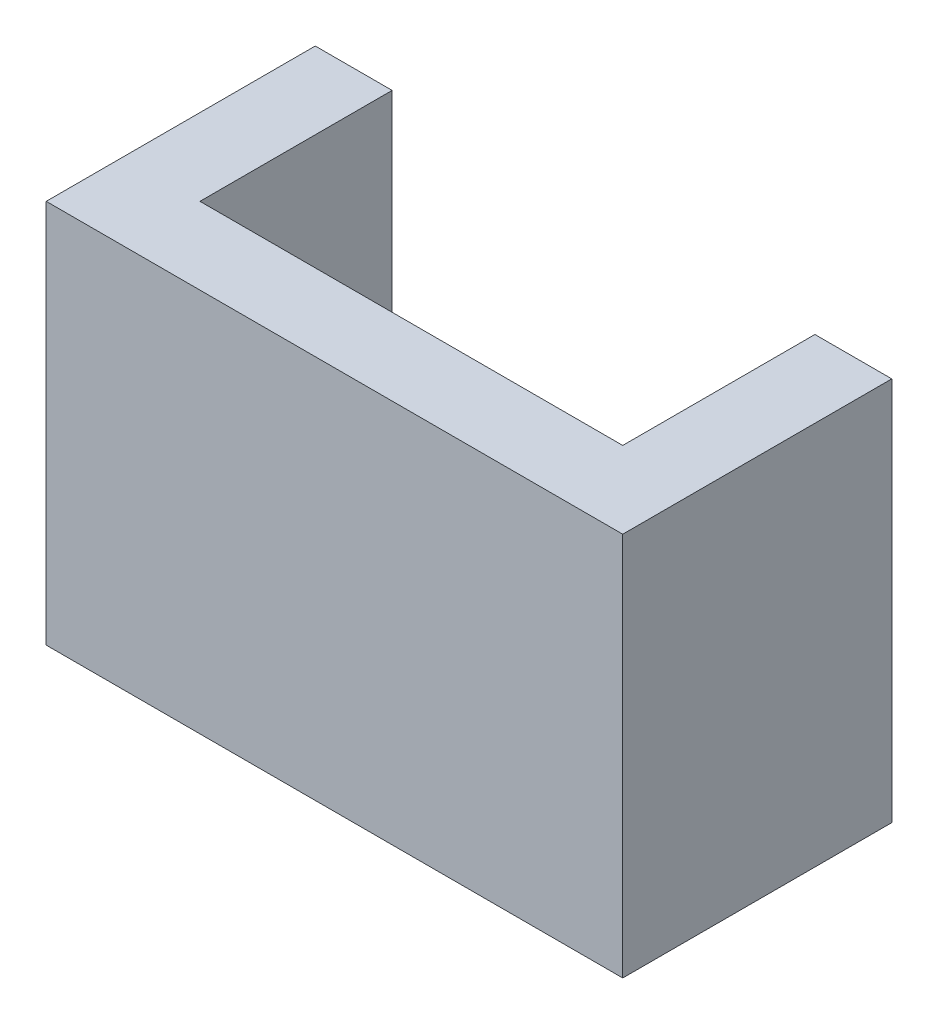
ISO-10303-21;
HEADER;
FILE_DESCRIPTION(('STEP AP214'),'2;1');
FILE_NAME('part.step','',(''),(''),'','','');
FILE_SCHEMA(('AUTOMOTIVE_DESIGN { 1 0 10303 214 1 1 1 1 }'));
ENDSEC;
DATA;
#1=APPLICATION_CONTEXT('core data for automotive mechanical design processes');
#2=APPLICATION_PROTOCOL_DEFINITION('international standard','automotive_design',2000,#1);
#3=PRODUCT_CONTEXT('',#1,'mechanical');
#4=PRODUCT('Part','Part','',(#3));
#5=PRODUCT_RELATED_PRODUCT_CATEGORY('part','',(#4));
#6=PRODUCT_DEFINITION_FORMATION('','',#4);
#7=PRODUCT_DEFINITION_CONTEXT('part definition',#1,'design');
#8=PRODUCT_DEFINITION('design','',#6,#7);
#9=PRODUCT_DEFINITION_SHAPE('','',#8);
#10=(LENGTH_UNIT() NAMED_UNIT(*) SI_UNIT(.MILLI.,.METRE.));
#11=(NAMED_UNIT(*) PLANE_ANGLE_UNIT() SI_UNIT($,.RADIAN.));
#12=(NAMED_UNIT(*) SI_UNIT($,.STERADIAN.) SOLID_ANGLE_UNIT());
#13=UNCERTAINTY_MEASURE_WITH_UNIT(LENGTH_MEASURE(1.E-05),#10,'distance_accuracy_value','');
#14=(GEOMETRIC_REPRESENTATION_CONTEXT(3) GLOBAL_UNCERTAINTY_ASSIGNED_CONTEXT((#13)) GLOBAL_UNIT_ASSIGNED_CONTEXT((#10,
#11,#12)) REPRESENTATION_CONTEXT('',''));
#15=CARTESIAN_POINT('',(0.,0.,0.));
#16=DIRECTION('',(0.,0.,1.));
#17=DIRECTION('',(1.,0.,0.));
#18=AXIS2_PLACEMENT_3D('',#15,#16,#17);
#19=CARTESIAN_POINT('',(0.,0.,0.));
#20=DIRECTION('',(0.,0.,1.));
#21=DIRECTION('',(1.,0.,0.));
#22=AXIS2_PLACEMENT_3D('',#19,#20,#21);
#23=PLANE('',#22);
#24=DIRECTION('',(-1.,0.,0.));
#25=VECTOR('',#24,1.);
#26=CARTESIAN_POINT('',(-7.17780429594272,3.9200477326969,0.));
#27=LINE('',#26,#25);
#28=CARTESIAN_POINT('',(-5.17780429594272,3.9200477326969,0.));
#29=VERTEX_POINT('',#28);
#30=CARTESIAN_POINT('',(-7.17780429594272,3.9200477326969,0.));
#31=VERTEX_POINT('',#30);
#32=EDGE_CURVE('E85',#29,#31,#27,.T.);
#33=ORIENTED_EDGE('',*,*,#32,.F.);
#34=DIRECTION('',(0.,1.,0.));
#35=VECTOR('',#34,1.);
#36=CARTESIAN_POINT('',(-5.17780429594272,-18.1629982408977,0.));
#37=LINE('',#36,#35);
#38=CARTESIAN_POINT('',(-5.17780429594272,-6.0799522673031,0.));
#39=VERTEX_POINT('',#38);
#40=EDGE_CURVE('E130',#39,#29,#37,.T.);
#41=ORIENTED_EDGE('',*,*,#40,.F.);
#42=DIRECTION('',(1.,0.,0.));
#43=VECTOR('',#42,1.);
#44=CARTESIAN_POINT('',(-7.17780429594271,-6.0799522673031,0.));
#45=LINE('',#44,#43);
#46=CARTESIAN_POINT('',(-7.17780429594271,-6.0799522673031,0.));
#47=VERTEX_POINT('',#46);
#48=EDGE_CURVE('E169',#47,#39,#45,.T.);
#49=ORIENTED_EDGE('',*,*,#48,.F.);
#50=DIRECTION('',(0.,-1.,0.));
#51=VECTOR('',#50,1.);
#52=CARTESIAN_POINT('',(-7.17780429594272,3.9200477326969,0.));
#53=LINE('',#52,#51);
#54=EDGE_CURVE('E151',#31,#47,#53,.T.);
#55=ORIENTED_EDGE('',*,*,#54,.F.);
#56=EDGE_LOOP('',(#33,#41,#49,#55));
#57=FACE_BOUND('',#56,.T.);
#58=ADVANCED_FACE('F39',(#57),#23,.F.);
#59=CARTESIAN_POINT('',(-7.17780429594272,3.9200477326969,7.));
#60=DIRECTION('',(1.,0.,0.));
#61=DIRECTION('',(0.,1.,0.));
#62=AXIS2_PLACEMENT_3D('',#59,#60,#61);
#63=PLANE('',#62);
#64=ORIENTED_EDGE('',*,*,#54,.T.);
#65=DIRECTION('',(0.,0.,-1.));
#66=VECTOR('',#65,1.);
#67=CARTESIAN_POINT('',(-7.17780429594271,-6.0799522673031,7.));
#68=LINE('',#67,#66);
#69=CARTESIAN_POINT('',(-7.17780429594271,-6.0799522673031,7.));
#70=VERTEX_POINT('',#69);
#71=EDGE_CURVE('E11',#70,#47,#68,.T.);
#72=ORIENTED_EDGE('',*,*,#71,.F.);
#73=DIRECTION('',(0.,-1.,0.));
#74=VECTOR('',#73,1.);
#75=CARTESIAN_POINT('',(-7.17780429594272,3.9200477326969,7.));
#76=LINE('',#75,#74);
#77=CARTESIAN_POINT('',(-7.17780429594272,3.9200477326969,7.));
#78=VERTEX_POINT('',#77);
#79=EDGE_CURVE('E153',#78,#70,#76,.T.);
#80=ORIENTED_EDGE('',*,*,#79,.F.);
#81=DIRECTION('',(0.,0.,-1.));
#82=VECTOR('',#81,1.);
#83=CARTESIAN_POINT('',(-7.17780429594272,3.9200477326969,7.));
#84=LINE('',#83,#82);
#85=EDGE_CURVE('E164',#78,#31,#84,.T.);
#86=ORIENTED_EDGE('',*,*,#85,.T.);
#87=EDGE_LOOP('',(#64,#72,#80,#86));
#88=FACE_BOUND('',#87,.T.);
#89=ADVANCED_FACE('F41',(#88),#63,.F.);
#90=CARTESIAN_POINT('',(-7.17780429594271,-6.0799522673031,7.));
#91=DIRECTION('',(0.,1.,0.));
#92=DIRECTION('',(0.,0.,1.));
#93=AXIS2_PLACEMENT_3D('',#90,#91,#92);
#94=PLANE('',#93);
#95=ORIENTED_EDGE('',*,*,#48,.T.);
#96=DIRECTION('',(0.,0.,-1.));
#97=VECTOR('',#96,1.);
#98=CARTESIAN_POINT('',(-5.17780429594272,-6.0799522673031,0.));
#99=LINE('',#98,#97);
#100=CARTESIAN_POINT('',(-5.17780429594271,-6.0799522673031,5.));
#101=VERTEX_POINT('',#100);
#102=EDGE_CURVE('E152',#101,#39,#99,.T.);
#103=ORIENTED_EDGE('',*,*,#102,.F.);
#104=DIRECTION('',(-1.,0.,0.));
#105=VECTOR('',#104,1.);
#106=CARTESIAN_POINT('',(-5.17780429594271,-6.0799522673031,5.));
#107=LINE('',#106,#105);
#108=CARTESIAN_POINT('',(5.82219570405728,-6.07995226730311,5.));
#109=VERTEX_POINT('',#108);
#110=EDGE_CURVE('E121',#109,#101,#107,.T.);
#111=ORIENTED_EDGE('',*,*,#110,.F.);
#112=DIRECTION('',(0.,0.,1.));
#113=VECTOR('',#112,1.);
#114=CARTESIAN_POINT('',(5.82219570405728,-6.0799522673031,0.));
#115=LINE('',#114,#113);
#116=CARTESIAN_POINT('',(5.82219570405728,-6.0799522673031,0.));
#117=VERTEX_POINT('',#116);
#118=EDGE_CURVE('E143',#117,#109,#115,.T.);
#119=ORIENTED_EDGE('',*,*,#118,.F.);
#120=CARTESIAN_POINT('',(7.82219570405729,-6.0799522673031,0.));
#121=VERTEX_POINT('',#120);
#122=EDGE_CURVE('E168',#117,#121,#45,.T.);
#123=ORIENTED_EDGE('',*,*,#122,.T.);
#124=DIRECTION('',(0.,0.,-1.));
#125=VECTOR('',#124,1.);
#126=CARTESIAN_POINT('',(7.82219570405729,-6.0799522673031,7.));
#127=LINE('',#126,#125);
#128=CARTESIAN_POINT('',(7.82219570405729,-6.0799522673031,7.));
#129=VERTEX_POINT('',#128);
#130=EDGE_CURVE('E48',#129,#121,#127,.T.);
#131=ORIENTED_EDGE('',*,*,#130,.F.);
#132=DIRECTION('',(1.,0.,0.));
#133=VECTOR('',#132,1.);
#134=CARTESIAN_POINT('',(-7.17780429594271,-6.0799522673031,7.));
#135=LINE('',#134,#133);
#136=EDGE_CURVE('E92',#70,#129,#135,.T.);
#137=ORIENTED_EDGE('',*,*,#136,.F.);
#138=ORIENTED_EDGE('',*,*,#71,.T.);
#139=EDGE_LOOP('',(#95,#103,#111,#119,#123,#131,#137,#138));
#140=FACE_BOUND('',#139,.T.);
#141=ADVANCED_FACE('F213',(#140),#94,.F.);
#142=CARTESIAN_POINT('',(7.82219570405728,3.9200477326969,7.));
#143=DIRECTION('',(-1.,0.,0.));
#144=DIRECTION('',(0.,-1.,0.));
#145=AXIS2_PLACEMENT_3D('',#142,#143,#144);
#146=PLANE('',#145);
#147=DIRECTION('',(0.,1.,0.));
#148=VECTOR('',#147,1.);
#149=CARTESIAN_POINT('',(7.82219570405728,3.9200477326969,0.));
#150=LINE('',#149,#148);
#151=CARTESIAN_POINT('',(7.82219570405728,3.9200477326969,0.));
#152=VERTEX_POINT('',#151);
#153=EDGE_CURVE('E173',#121,#152,#150,.T.);
#154=ORIENTED_EDGE('',*,*,#153,.T.);
#155=DIRECTION('',(0.,0.,-1.));
#156=VECTOR('',#155,1.);
#157=CARTESIAN_POINT('',(7.82219570405728,3.9200477326969,7.));
#158=LINE('',#157,#156);
#159=CARTESIAN_POINT('',(7.82219570405728,3.9200477326969,7.));
#160=VERTEX_POINT('',#159);
#161=EDGE_CURVE('E180',#160,#152,#158,.T.);
#162=ORIENTED_EDGE('',*,*,#161,.F.);
#163=DIRECTION('',(0.,1.,0.));
#164=VECTOR('',#163,1.);
#165=CARTESIAN_POINT('',(7.82219570405728,3.9200477326969,7.));
#166=LINE('',#165,#164);
#167=EDGE_CURVE('E159',#129,#160,#166,.T.);
#168=ORIENTED_EDGE('',*,*,#167,.F.);
#169=ORIENTED_EDGE('',*,*,#130,.T.);
#170=EDGE_LOOP('',(#154,#162,#168,#169));
#171=FACE_BOUND('',#170,.T.);
#172=ADVANCED_FACE('F188',(#171),#146,.F.);
#173=CARTESIAN_POINT('',(-7.17780429594272,3.9200477326969,7.));
#174=DIRECTION('',(0.,-1.,0.));
#175=DIRECTION('',(0.,0.,-1.));
#176=AXIS2_PLACEMENT_3D('',#173,#174,#175);
#177=PLANE('',#176);
#178=DIRECTION('',(1.,0.,0.));
#179=VECTOR('',#178,1.);
#180=CARTESIAN_POINT('',(-5.17780429594271,3.9200477326969,5.));
#181=LINE('',#180,#179);
#182=CARTESIAN_POINT('',(-5.17780429594271,3.9200477326969,5.));
#183=VERTEX_POINT('',#182);
#184=CARTESIAN_POINT('',(5.82219570405728,3.9200477326969,5.));
#185=VERTEX_POINT('',#184);
#186=EDGE_CURVE('E119',#183,#185,#181,.T.);
#187=ORIENTED_EDGE('',*,*,#186,.F.);
#188=DIRECTION('',(0.,0.,1.));
#189=VECTOR('',#188,1.);
#190=CARTESIAN_POINT('',(-5.17780429594272,3.9200477326969,0.));
#191=LINE('',#190,#189);
#192=EDGE_CURVE('E127',#29,#183,#191,.T.);
#193=ORIENTED_EDGE('',*,*,#192,.F.);
#194=ORIENTED_EDGE('',*,*,#32,.T.);
#195=ORIENTED_EDGE('',*,*,#85,.F.);
#196=DIRECTION('',(-1.,0.,0.));
#197=VECTOR('',#196,1.);
#198=CARTESIAN_POINT('',(-7.17780429594272,3.9200477326969,7.));
#199=LINE('',#198,#197);
#200=EDGE_CURVE('E64',#160,#78,#199,.T.);
#201=ORIENTED_EDGE('',*,*,#200,.F.);
#202=ORIENTED_EDGE('',*,*,#161,.T.);
#203=CARTESIAN_POINT('',(5.82219570405729,3.9200477326969,0.));
#204=VERTEX_POINT('',#203);
#205=EDGE_CURVE('E156',#152,#204,#27,.T.);
#206=ORIENTED_EDGE('',*,*,#205,.T.);
#207=DIRECTION('',(0.,0.,-1.));
#208=VECTOR('',#207,1.);
#209=CARTESIAN_POINT('',(5.82219570405728,3.9200477326969,0.));
#210=LINE('',#209,#208);
#211=EDGE_CURVE('E55',#185,#204,#210,.T.);
#212=ORIENTED_EDGE('',*,*,#211,.F.);
#213=EDGE_LOOP('',(#187,#193,#194,#195,#201,#202,#206,#212));
#214=FACE_BOUND('',#213,.T.);
#215=ADVANCED_FACE('F133',(#214),#177,.F.);
#216=CARTESIAN_POINT('',(0.,0.,7.));
#217=DIRECTION('',(0.,0.,1.));
#218=DIRECTION('',(1.,0.,0.));
#219=AXIS2_PLACEMENT_3D('',#216,#217,#218);
#220=PLANE('',#219);
#221=ORIENTED_EDGE('',*,*,#79,.T.);
#222=ORIENTED_EDGE('',*,*,#136,.T.);
#223=ORIENTED_EDGE('',*,*,#167,.T.);
#224=ORIENTED_EDGE('',*,*,#200,.T.);
#225=EDGE_LOOP('',(#221,#222,#223,#224));
#226=FACE_BOUND('',#225,.T.);
#227=ADVANCED_FACE('F198',(#226),#220,.T.);
#228=ORIENTED_EDGE('',*,*,#122,.F.);
#229=DIRECTION('',(0.,1.,0.));
#230=VECTOR('',#229,1.);
#231=CARTESIAN_POINT('',(5.82219570405728,-18.1629982408977,0.));
#232=LINE('',#231,#230);
#233=EDGE_CURVE('E144',#117,#204,#232,.T.);
#234=ORIENTED_EDGE('',*,*,#233,.T.);
#235=ORIENTED_EDGE('',*,*,#205,.F.);
#236=ORIENTED_EDGE('',*,*,#153,.F.);
#237=EDGE_LOOP('',(#228,#234,#235,#236));
#238=FACE_BOUND('',#237,.T.);
#239=ADVANCED_FACE('F193',(#238),#23,.F.);
#240=CARTESIAN_POINT('',(-5.17780429594272,-18.1629982408977,0.));
#241=DIRECTION('',(-1.,0.,0.));
#242=DIRECTION('',(0.,0.,1.));
#243=AXIS2_PLACEMENT_3D('',#240,#241,#242);
#244=PLANE('',#243);
#245=ORIENTED_EDGE('',*,*,#102,.T.);
#246=ORIENTED_EDGE('',*,*,#40,.T.);
#247=ORIENTED_EDGE('',*,*,#192,.T.);
#248=DIRECTION('',(0.,1.,0.));
#249=VECTOR('',#248,1.);
#250=CARTESIAN_POINT('',(-5.17780429594271,-18.1629982408977,5.));
#251=LINE('',#250,#249);
#252=EDGE_CURVE('E114',#101,#183,#251,.T.);
#253=ORIENTED_EDGE('',*,*,#252,.F.);
#254=EDGE_LOOP('',(#245,#246,#247,#253));
#255=FACE_BOUND('',#254,.T.);
#256=ADVANCED_FACE('F128',(#255),#244,.F.);
#257=CARTESIAN_POINT('',(5.82219570405728,-18.1629982408977,0.));
#258=DIRECTION('',(1.,0.,0.));
#259=DIRECTION('',(0.,0.,-1.));
#260=AXIS2_PLACEMENT_3D('',#257,#258,#259);
#261=PLANE('',#260);
#262=ORIENTED_EDGE('',*,*,#118,.T.);
#263=DIRECTION('',(0.,1.,0.));
#264=VECTOR('',#263,1.);
#265=CARTESIAN_POINT('',(5.82219570405728,-18.1629982408977,5.));
#266=LINE('',#265,#264);
#267=EDGE_CURVE('E125',#109,#185,#266,.T.);
#268=ORIENTED_EDGE('',*,*,#267,.T.);
#269=ORIENTED_EDGE('',*,*,#211,.T.);
#270=ORIENTED_EDGE('',*,*,#233,.F.);
#271=EDGE_LOOP('',(#262,#268,#269,#270));
#272=FACE_BOUND('',#271,.T.);
#273=ADVANCED_FACE('F225',(#272),#261,.F.);
#274=CARTESIAN_POINT('',(-5.17780429594271,-18.1629982408977,5.));
#275=DIRECTION('',(0.,0.,1.));
#276=DIRECTION('',(1.,0.,0.));
#277=AXIS2_PLACEMENT_3D('',#274,#275,#276);
#278=PLANE('',#277);
#279=ORIENTED_EDGE('',*,*,#110,.T.);
#280=ORIENTED_EDGE('',*,*,#252,.T.);
#281=ORIENTED_EDGE('',*,*,#186,.T.);
#282=ORIENTED_EDGE('',*,*,#267,.F.);
#283=EDGE_LOOP('',(#279,#280,#281,#282));
#284=FACE_BOUND('',#283,.T.);
#285=ADVANCED_FACE('F116',(#284),#278,.F.);
#286=CLOSED_SHELL('',(#58,#89,#141,#172,#215,#227,#239,#256,#273,#285));
#287=MANIFOLD_SOLID_BREP('B2',#286);
#288=ADVANCED_BREP_SHAPE_REPRESENTATION('',(#18,#287),#14);
#289=SHAPE_DEFINITION_REPRESENTATION(#9,#288);
ENDSEC;
END-ISO-10303-21;
